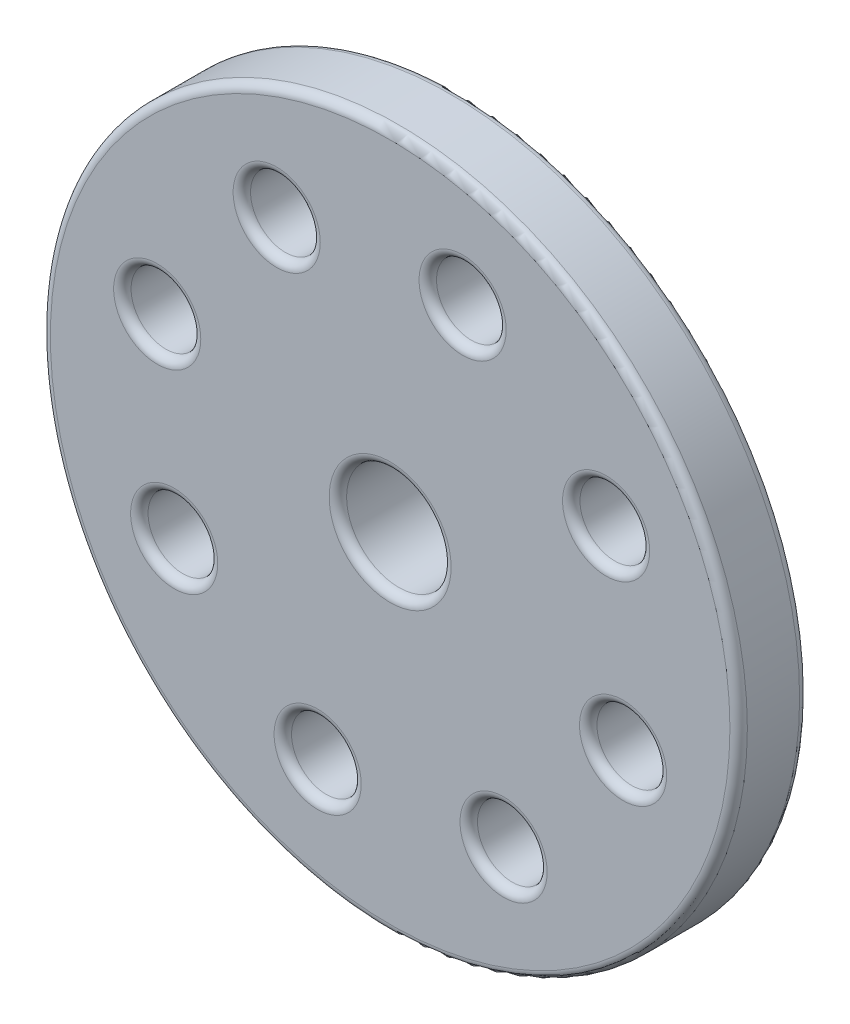
ISO-10303-21;
HEADER;
FILE_DESCRIPTION(('STEP AP214'),'2;1');
FILE_NAME('part.step','',(''),(''),'','','');
FILE_SCHEMA(('AUTOMOTIVE_DESIGN { 1 0 10303 214 1 1 1 1 }'));
ENDSEC;
DATA;
#1=APPLICATION_CONTEXT('core data for automotive mechanical design processes');
#2=APPLICATION_PROTOCOL_DEFINITION('international standard','automotive_design',2000,#1);
#3=PRODUCT_CONTEXT('',#1,'mechanical');
#4=PRODUCT('Part','Part','',(#3));
#5=PRODUCT_RELATED_PRODUCT_CATEGORY('part','',(#4));
#6=PRODUCT_DEFINITION_FORMATION('','',#4);
#7=PRODUCT_DEFINITION_CONTEXT('part definition',#1,'design');
#8=PRODUCT_DEFINITION('design','',#6,#7);
#9=PRODUCT_DEFINITION_SHAPE('','',#8);
#10=(LENGTH_UNIT() NAMED_UNIT(*) SI_UNIT(.MILLI.,.METRE.));
#11=(NAMED_UNIT(*) PLANE_ANGLE_UNIT() SI_UNIT($,.RADIAN.));
#12=(NAMED_UNIT(*) SI_UNIT($,.STERADIAN.) SOLID_ANGLE_UNIT());
#13=UNCERTAINTY_MEASURE_WITH_UNIT(LENGTH_MEASURE(1.E-05),#10,'distance_accuracy_value','');
#14=(GEOMETRIC_REPRESENTATION_CONTEXT(3) GLOBAL_UNCERTAINTY_ASSIGNED_CONTEXT((#13)) GLOBAL_UNIT_ASSIGNED_CONTEXT((#10,
#11,#12)) REPRESENTATION_CONTEXT('',''));
#15=CARTESIAN_POINT('',(0.,0.,0.));
#16=DIRECTION('',(0.,0.,1.));
#17=DIRECTION('',(1.,0.,0.));
#18=AXIS2_PLACEMENT_3D('',#15,#16,#17);
#19=CARTESIAN_POINT('',(-14.5012777172546,-1.85900163897672,0.));
#20=DIRECTION('',(0.,0.,1.));
#21=DIRECTION('',(1.,0.,0.));
#22=AXIS2_PLACEMENT_3D('',#19,#20,#21);
#23=PLANE('',#22);
#24=CARTESIAN_POINT('',(-7.81748126239068,-3.93911340278849,0.));
#25=DIRECTION('',(0.,0.,1.));
#26=DIRECTION('',(1.,0.,0.));
#27=AXIS2_PLACEMENT_3D('',#24,#25,#26);
#28=CIRCLE('',#27,1.25);
#29=CARTESIAN_POINT('',(-6.56748126239068,-3.93911340278849,0.));
#30=VERTEX_POINT('',#29);
#31=EDGE_CURVE('E88',#30,#30,#28,.T.);
#32=ORIENTED_EDGE('',*,*,#31,.T.);
#33=EDGE_LOOP('',(#32));
#34=FACE_BOUND('',#33,.T.);
#35=CARTESIAN_POINT('',(-11.2459810537669,-8.05602057009882,0.));
#36=DIRECTION('',(0.,0.,1.));
#37=DIRECTION('',(1.,0.,0.));
#38=AXIS2_PLACEMENT_3D('',#35,#36,#37);
#39=CIRCLE('',#38,1.25);
#40=CARTESIAN_POINT('',(-9.9959810537669,-8.05602057009882,0.));
#41=VERTEX_POINT('',#40);
#42=EDGE_CURVE('E91',#41,#41,#39,.T.);
#43=ORIENTED_EDGE('',*,*,#42,.T.);
#44=EDGE_LOOP('',(#43));
#45=FACE_BOUND('',#44,.T.);
#46=CARTESIAN_POINT('',(-16.5813894810664,-8.54279809384068,0.));
#47=DIRECTION('',(0.,0.,1.));
#48=DIRECTION('',(1.,0.,0.));
#49=AXIS2_PLACEMENT_3D('',#46,#47,#48);
#50=CIRCLE('',#49,1.25);
#51=CARTESIAN_POINT('',(-15.3313894810664,-8.54279809384068,0.));
#52=VERTEX_POINT('',#51);
#53=EDGE_CURVE('E94',#52,#52,#50,.T.);
#54=ORIENTED_EDGE('',*,*,#53,.T.);
#55=EDGE_LOOP('',(#54));
#56=FACE_BOUND('',#55,.T.);
#57=CARTESIAN_POINT('',(-20.6982966483767,-5.11429830246442,0.));
#58=DIRECTION('',(0.,0.,1.));
#59=DIRECTION('',(1.,0.,0.));
#60=AXIS2_PLACEMENT_3D('',#57,#58,#59);
#61=CIRCLE('',#60,1.25);
#62=CARTESIAN_POINT('',(-19.4482966483767,-5.11429830246442,0.));
#63=VERTEX_POINT('',#62);
#64=EDGE_CURVE('E97',#63,#63,#61,.T.);
#65=ORIENTED_EDGE('',*,*,#64,.T.);
#66=EDGE_LOOP('',(#65));
#67=FACE_BOUND('',#66,.T.);
#68=CARTESIAN_POINT('',(-21.1850741721186,0.22111012483505,0.));
#69=DIRECTION('',(0.,0.,1.));
#70=DIRECTION('',(1.,0.,0.));
#71=AXIS2_PLACEMENT_3D('',#68,#69,#70);
#72=CIRCLE('',#71,1.25);
#73=CARTESIAN_POINT('',(-19.9350741721186,0.22111012483505,0.));
#74=VERTEX_POINT('',#73);
#75=EDGE_CURVE('E100',#74,#74,#72,.T.);
#76=ORIENTED_EDGE('',*,*,#75,.T.);
#77=EDGE_LOOP('',(#76));
#78=FACE_BOUND('',#77,.T.);
#79=CARTESIAN_POINT('',(-17.7565743807423,4.3380172921454,0.));
#80=DIRECTION('',(0.,0.,1.));
#81=DIRECTION('',(1.,0.,0.));
#82=AXIS2_PLACEMENT_3D('',#79,#80,#81);
#83=CIRCLE('',#82,1.25);
#84=CARTESIAN_POINT('',(-16.5065743807423,4.3380172921454,0.));
#85=VERTEX_POINT('',#84);
#86=EDGE_CURVE('E103',#85,#85,#83,.T.);
#87=ORIENTED_EDGE('',*,*,#86,.T.);
#88=EDGE_LOOP('',(#87));
#89=FACE_BOUND('',#88,.T.);
#90=CARTESIAN_POINT('',(-12.4211659534428,4.82479481588722,0.));
#91=DIRECTION('',(0.,0.,1.));
#92=DIRECTION('',(1.,0.,0.));
#93=AXIS2_PLACEMENT_3D('',#90,#91,#92);
#94=CIRCLE('',#93,1.25);
#95=CARTESIAN_POINT('',(-11.1711659534428,4.82479481588722,0.));
#96=VERTEX_POINT('',#95);
#97=EDGE_CURVE('E106',#96,#96,#94,.T.);
#98=ORIENTED_EDGE('',*,*,#97,.T.);
#99=EDGE_LOOP('',(#98));
#100=FACE_BOUND('',#99,.T.);
#101=CARTESIAN_POINT('',(-8.30425878613253,1.39629502451098,0.));
#102=DIRECTION('',(0.,0.,1.));
#103=DIRECTION('',(1.,0.,0.));
#104=AXIS2_PLACEMENT_3D('',#101,#102,#103);
#105=CIRCLE('',#104,1.24999999999999);
#106=CARTESIAN_POINT('',(-7.05425878613253,1.39629502451098,0.));
#107=VERTEX_POINT('',#106);
#108=EDGE_CURVE('E109',#107,#107,#105,.T.);
#109=ORIENTED_EDGE('',*,*,#108,.T.);
#110=EDGE_LOOP('',(#109));
#111=FACE_BOUND('',#110,.T.);
#112=CARTESIAN_POINT('',(-14.5012777172546,-1.85900163897672,0.));
#113=DIRECTION('',(0.,0.,1.));
#114=DIRECTION('',(1.,0.,0.));
#115=AXIS2_PLACEMENT_3D('',#112,#113,#114);
#116=CIRCLE('',#115,9.75000000000001);
#117=CARTESIAN_POINT('',(-4.75127771725463,-1.85900163897672,0.));
#118=VERTEX_POINT('',#117);
#119=EDGE_CURVE('E154',#118,#118,#116,.F.);
#120=ORIENTED_EDGE('',*,*,#119,.T.);
#121=EDGE_LOOP('',(#120));
#122=FACE_BOUND('',#121,.T.);
#123=CARTESIAN_POINT('',(-14.5012777172546,-1.85900163897672,0.));
#124=DIRECTION('',(0.,0.,1.));
#125=DIRECTION('',(1.,0.,0.));
#126=AXIS2_PLACEMENT_3D('',#123,#124,#125);
#127=CIRCLE('',#126,5.);
#128=CARTESIAN_POINT('',(-9.50127771725463,-1.85900163897672,0.));
#129=VERTEX_POINT('',#128);
#130=EDGE_CURVE('E163',#129,#129,#127,.F.);
#131=ORIENTED_EDGE('',*,*,#130,.F.);
#132=EDGE_LOOP('',(#131));
#133=FACE_BOUND('',#132,.T.);
#134=ADVANCED_FACE('F32',(#34,#45,#56,#67,#78,#89,#100,#111,#122,#133),#23,.F.);
#135=CARTESIAN_POINT('',(-14.5012777172546,-1.85900163897672,2.));
#136=DIRECTION('',(0.,0.,1.));
#137=DIRECTION('',(1.,0.,0.));
#138=AXIS2_PLACEMENT_3D('',#135,#136,#137);
#139=PLANE('',#138);
#140=CARTESIAN_POINT('',(-14.5012777172546,-1.85900163897672,2.));
#141=DIRECTION('',(0.,0.,1.));
#142=DIRECTION('',(1.,0.,0.));
#143=AXIS2_PLACEMENT_3D('',#140,#141,#142);
#144=CIRCLE('',#143,1.75);
#145=CARTESIAN_POINT('',(-12.7512777172546,-1.85900163897672,2.));
#146=VERTEX_POINT('',#145);
#147=EDGE_CURVE('E112',#146,#146,#144,.F.);
#148=ORIENTED_EDGE('',*,*,#147,.T.);
#149=EDGE_LOOP('',(#148));
#150=FACE_BOUND('',#149,.T.);
#151=CARTESIAN_POINT('',(-7.81748126239068,-3.93911340278849,2.));
#152=DIRECTION('',(0.,0.,1.));
#153=DIRECTION('',(1.,0.,0.));
#154=AXIS2_PLACEMENT_3D('',#151,#152,#153);
#155=CIRCLE('',#154,1.25);
#156=CARTESIAN_POINT('',(-6.56748126239068,-3.93911340278849,2.));
#157=VERTEX_POINT('',#156);
#158=EDGE_CURVE('E115',#157,#157,#155,.F.);
#159=ORIENTED_EDGE('',*,*,#158,.T.);
#160=EDGE_LOOP('',(#159));
#161=FACE_BOUND('',#160,.T.);
#162=CARTESIAN_POINT('',(-11.2459810537669,-8.05602057009882,2.));
#163=DIRECTION('',(0.,0.,1.));
#164=DIRECTION('',(1.,0.,0.));
#165=AXIS2_PLACEMENT_3D('',#162,#163,#164);
#166=CIRCLE('',#165,1.25);
#167=CARTESIAN_POINT('',(-9.9959810537669,-8.05602057009882,2.));
#168=VERTEX_POINT('',#167);
#169=EDGE_CURVE('E118',#168,#168,#166,.F.);
#170=ORIENTED_EDGE('',*,*,#169,.T.);
#171=EDGE_LOOP('',(#170));
#172=FACE_BOUND('',#171,.T.);
#173=CARTESIAN_POINT('',(-16.5813894810664,-8.54279809384068,2.));
#174=DIRECTION('',(0.,0.,1.));
#175=DIRECTION('',(1.,0.,0.));
#176=AXIS2_PLACEMENT_3D('',#173,#174,#175);
#177=CIRCLE('',#176,1.25);
#178=CARTESIAN_POINT('',(-15.3313894810664,-8.54279809384068,2.));
#179=VERTEX_POINT('',#178);
#180=EDGE_CURVE('E121',#179,#179,#177,.F.);
#181=ORIENTED_EDGE('',*,*,#180,.T.);
#182=EDGE_LOOP('',(#181));
#183=FACE_BOUND('',#182,.T.);
#184=CARTESIAN_POINT('',(-20.6982966483767,-5.11429830246442,2.));
#185=DIRECTION('',(0.,0.,1.));
#186=DIRECTION('',(1.,0.,0.));
#187=AXIS2_PLACEMENT_3D('',#184,#185,#186);
#188=CIRCLE('',#187,1.25);
#189=CARTESIAN_POINT('',(-19.4482966483767,-5.11429830246442,2.));
#190=VERTEX_POINT('',#189);
#191=EDGE_CURVE('E124',#190,#190,#188,.F.);
#192=ORIENTED_EDGE('',*,*,#191,.T.);
#193=EDGE_LOOP('',(#192));
#194=FACE_BOUND('',#193,.T.);
#195=CARTESIAN_POINT('',(-21.1850741721186,0.22111012483505,2.));
#196=DIRECTION('',(0.,0.,1.));
#197=DIRECTION('',(1.,0.,0.));
#198=AXIS2_PLACEMENT_3D('',#195,#196,#197);
#199=CIRCLE('',#198,1.25);
#200=CARTESIAN_POINT('',(-19.9350741721186,0.22111012483505,2.));
#201=VERTEX_POINT('',#200);
#202=EDGE_CURVE('E127',#201,#201,#199,.F.);
#203=ORIENTED_EDGE('',*,*,#202,.T.);
#204=EDGE_LOOP('',(#203));
#205=FACE_BOUND('',#204,.T.);
#206=CARTESIAN_POINT('',(-17.7565743807423,4.3380172921454,2.));
#207=DIRECTION('',(0.,0.,1.));
#208=DIRECTION('',(1.,0.,0.));
#209=AXIS2_PLACEMENT_3D('',#206,#207,#208);
#210=CIRCLE('',#209,1.25);
#211=CARTESIAN_POINT('',(-16.5065743807423,4.3380172921454,2.));
#212=VERTEX_POINT('',#211);
#213=EDGE_CURVE('E130',#212,#212,#210,.F.);
#214=ORIENTED_EDGE('',*,*,#213,.T.);
#215=EDGE_LOOP('',(#214));
#216=FACE_BOUND('',#215,.T.);
#217=CARTESIAN_POINT('',(-12.4211659534428,4.82479481588722,2.));
#218=DIRECTION('',(0.,0.,1.));
#219=DIRECTION('',(1.,0.,0.));
#220=AXIS2_PLACEMENT_3D('',#217,#218,#219);
#221=CIRCLE('',#220,1.25);
#222=CARTESIAN_POINT('',(-11.1711659534428,4.82479481588722,2.));
#223=VERTEX_POINT('',#222);
#224=EDGE_CURVE('E133',#223,#223,#221,.F.);
#225=ORIENTED_EDGE('',*,*,#224,.T.);
#226=EDGE_LOOP('',(#225));
#227=FACE_BOUND('',#226,.T.);
#228=CARTESIAN_POINT('',(-8.30425878613253,1.39629502451098,2.));
#229=DIRECTION('',(0.,0.,1.));
#230=DIRECTION('',(1.,0.,0.));
#231=AXIS2_PLACEMENT_3D('',#228,#229,#230);
#232=CIRCLE('',#231,1.24999999999999);
#233=CARTESIAN_POINT('',(-7.05425878613253,1.39629502451098,2.));
#234=VERTEX_POINT('',#233);
#235=EDGE_CURVE('E136',#234,#234,#232,.F.);
#236=ORIENTED_EDGE('',*,*,#235,.T.);
#237=EDGE_LOOP('',(#236));
#238=FACE_BOUND('',#237,.T.);
#239=CARTESIAN_POINT('',(-14.5012777172546,-1.85900163897672,2.));
#240=DIRECTION('',(0.,0.,1.));
#241=DIRECTION('',(1.,0.,0.));
#242=AXIS2_PLACEMENT_3D('',#239,#240,#241);
#243=CIRCLE('',#242,9.75000000000001);
#244=CARTESIAN_POINT('',(-4.75127771725463,-1.85900163897672,2.));
#245=VERTEX_POINT('',#244);
#246=EDGE_CURVE('E151',#245,#245,#243,.T.);
#247=ORIENTED_EDGE('',*,*,#246,.T.);
#248=EDGE_LOOP('',(#247));
#249=FACE_BOUND('',#248,.T.);
#250=ADVANCED_FACE('F171',(#150,#161,#172,#183,#194,#205,#216,#227,#238,#249),#139,.T.);
#251=CARTESIAN_POINT('',(-14.5012777172546,-1.85900163897672,2.));
#252=DIRECTION('',(0.,0.,-1.));
#253=DIRECTION('',(-1.,0.,0.));
#254=AXIS2_PLACEMENT_3D('',#251,#252,#253);
#255=CYLINDRICAL_SURFACE('',#254,10.);
#256=CARTESIAN_POINT('',(-14.5012777172546,-1.85900163897672,1.75));
#257=DIRECTION('',(0.,0.,1.));
#258=DIRECTION('',(1.,0.,0.));
#259=AXIS2_PLACEMENT_3D('',#256,#257,#258);
#260=CIRCLE('',#259,10.);
#261=CARTESIAN_POINT('',(-4.50127771725463,-1.85900163897672,1.75));
#262=VERTEX_POINT('',#261);
#263=EDGE_CURVE('E148',#262,#262,#260,.F.);
#264=ORIENTED_EDGE('',*,*,#263,.T.);
#265=EDGE_LOOP('',(#264));
#266=FACE_BOUND('',#265,.T.);
#267=CARTESIAN_POINT('',(-14.5012777172546,-1.85900163897672,0.25));
#268=DIRECTION('',(0.,0.,1.));
#269=DIRECTION('',(1.,0.,0.));
#270=AXIS2_PLACEMENT_3D('',#267,#268,#269);
#271=CIRCLE('',#270,10.);
#272=CARTESIAN_POINT('',(-4.50127771725463,-1.85900163897672,0.25));
#273=VERTEX_POINT('',#272);
#274=EDGE_CURVE('E157',#273,#273,#271,.T.);
#275=ORIENTED_EDGE('',*,*,#274,.T.);
#276=EDGE_LOOP('',(#275));
#277=FACE_BOUND('',#276,.T.);
#278=ADVANCED_FACE('F177',(#266,#277),#255,.T.);
#279=CARTESIAN_POINT('',(-20.6982966483767,-5.11429830246442,2.));
#280=DIRECTION('',(0.,0.,-1.));
#281=DIRECTION('',(-1.,0.,0.));
#282=AXIS2_PLACEMENT_3D('',#279,#280,#281);
#283=CYLINDRICAL_SURFACE('',#282,1.);
#284=CARTESIAN_POINT('',(-20.6982966483767,-5.11429830246442,0.25));
#285=DIRECTION('',(0.,0.,1.));
#286=DIRECTION('',(1.,0.,0.));
#287=AXIS2_PLACEMENT_3D('',#284,#285,#286);
#288=CIRCLE('',#287,1.);
#289=CARTESIAN_POINT('',(-19.6982966483767,-5.11429830246442,0.25));
#290=VERTEX_POINT('',#289);
#291=EDGE_CURVE('E64',#290,#290,#288,.F.);
#292=ORIENTED_EDGE('',*,*,#291,.T.);
#293=EDGE_LOOP('',(#292));
#294=FACE_BOUND('',#293,.T.);
#295=CARTESIAN_POINT('',(-20.6982966483767,-5.11429830246442,1.75));
#296=DIRECTION('',(0.,0.,1.));
#297=DIRECTION('',(1.,0.,0.));
#298=AXIS2_PLACEMENT_3D('',#295,#296,#297);
#299=CIRCLE('',#298,1.);
#300=CARTESIAN_POINT('',(-19.6982966483767,-5.11429830246442,1.75));
#301=VERTEX_POINT('',#300);
#302=EDGE_CURVE('E67',#301,#301,#299,.T.);
#303=ORIENTED_EDGE('',*,*,#302,.T.);
#304=EDGE_LOOP('',(#303));
#305=FACE_BOUND('',#304,.T.);
#306=ADVANCED_FACE('F185',(#294,#305),#283,.F.);
#307=CARTESIAN_POINT('',(-14.5012777172546,-1.85900163897672,2.));
#308=DIRECTION('',(0.,0.,-1.));
#309=DIRECTION('',(-1.,0.,0.));
#310=AXIS2_PLACEMENT_3D('',#307,#308,#309);
#311=CYLINDRICAL_SURFACE('',#310,1.5);
#312=CARTESIAN_POINT('',(-14.5012777172546,-1.85900163897672,-0.75));
#313=DIRECTION('',(0.,0.,-1.));
#314=DIRECTION('',(-1.,0.,0.));
#315=AXIS2_PLACEMENT_3D('',#312,#313,#314);
#316=CIRCLE('',#315,1.5);
#317=CARTESIAN_POINT('',(-16.0012777172546,-1.85900163897672,-0.75));
#318=VERTEX_POINT('',#317);
#319=EDGE_CURVE('E142',#318,#318,#316,.T.);
#320=ORIENTED_EDGE('',*,*,#319,.T.);
#321=EDGE_LOOP('',(#320));
#322=FACE_BOUND('',#321,.T.);
#323=CARTESIAN_POINT('',(-14.5012777172546,-1.85900163897672,1.75));
#324=DIRECTION('',(0.,0.,1.));
#325=DIRECTION('',(1.,0.,0.));
#326=AXIS2_PLACEMENT_3D('',#323,#324,#325);
#327=CIRCLE('',#326,1.5);
#328=CARTESIAN_POINT('',(-13.0012777172546,-1.85900163897672,1.75));
#329=VERTEX_POINT('',#328);
#330=EDGE_CURVE('E145',#329,#329,#327,.T.);
#331=ORIENTED_EDGE('',*,*,#330,.T.);
#332=EDGE_LOOP('',(#331));
#333=FACE_BOUND('',#332,.T.);
#334=ADVANCED_FACE('F466',(#322,#333),#311,.F.);
#335=CARTESIAN_POINT('',(-16.5813894810664,-8.54279809384068,2.));
#336=DIRECTION('',(0.,0.,-1.));
#337=DIRECTION('',(-1.,0.,0.));
#338=AXIS2_PLACEMENT_3D('',#335,#336,#337);
#339=CYLINDRICAL_SURFACE('',#338,1.);
#340=CARTESIAN_POINT('',(-16.5813894810664,-8.54279809384068,0.25));
#341=DIRECTION('',(0.,0.,1.));
#342=DIRECTION('',(1.,0.,0.));
#343=AXIS2_PLACEMENT_3D('',#340,#341,#342);
#344=CIRCLE('',#343,1.);
#345=CARTESIAN_POINT('',(-15.5813894810664,-8.54279809384068,0.25));
#346=VERTEX_POINT('',#345);
#347=EDGE_CURVE('E70',#346,#346,#344,.F.);
#348=ORIENTED_EDGE('',*,*,#347,.T.);
#349=EDGE_LOOP('',(#348));
#350=FACE_BOUND('',#349,.T.);
#351=CARTESIAN_POINT('',(-16.5813894810664,-8.54279809384068,1.75));
#352=DIRECTION('',(0.,0.,1.));
#353=DIRECTION('',(1.,0.,0.));
#354=AXIS2_PLACEMENT_3D('',#351,#352,#353);
#355=CIRCLE('',#354,1.);
#356=CARTESIAN_POINT('',(-15.5813894810664,-8.54279809384068,1.75));
#357=VERTEX_POINT('',#356);
#358=EDGE_CURVE('E73',#357,#357,#355,.T.);
#359=ORIENTED_EDGE('',*,*,#358,.T.);
#360=EDGE_LOOP('',(#359));
#361=FACE_BOUND('',#360,.T.);
#362=ADVANCED_FACE('F456',(#350,#361),#339,.F.);
#363=CARTESIAN_POINT('',(-21.1850741721186,0.22111012483505,2.));
#364=DIRECTION('',(0.,0.,-1.));
#365=DIRECTION('',(-1.,0.,0.));
#366=AXIS2_PLACEMENT_3D('',#363,#364,#365);
#367=CYLINDRICAL_SURFACE('',#366,1.);
#368=CARTESIAN_POINT('',(-21.1850741721186,0.22111012483505,0.25));
#369=DIRECTION('',(0.,0.,1.));
#370=DIRECTION('',(1.,0.,0.));
#371=AXIS2_PLACEMENT_3D('',#368,#369,#370);
#372=CIRCLE('',#371,1.);
#373=CARTESIAN_POINT('',(-20.1850741721186,0.22111012483505,0.25));
#374=VERTEX_POINT('',#373);
#375=EDGE_CURVE('E58',#374,#374,#372,.F.);
#376=ORIENTED_EDGE('',*,*,#375,.T.);
#377=EDGE_LOOP('',(#376));
#378=FACE_BOUND('',#377,.T.);
#379=CARTESIAN_POINT('',(-21.1850741721186,0.22111012483505,1.75));
#380=DIRECTION('',(0.,0.,1.));
#381=DIRECTION('',(1.,0.,0.));
#382=AXIS2_PLACEMENT_3D('',#379,#380,#381);
#383=CIRCLE('',#382,1.);
#384=CARTESIAN_POINT('',(-20.1850741721186,0.22111012483505,1.75));
#385=VERTEX_POINT('',#384);
#386=EDGE_CURVE('E61',#385,#385,#383,.T.);
#387=ORIENTED_EDGE('',*,*,#386,.T.);
#388=EDGE_LOOP('',(#387));
#389=FACE_BOUND('',#388,.T.);
#390=ADVANCED_FACE('F446',(#378,#389),#367,.F.);
#391=CARTESIAN_POINT('',(-12.4211659534428,4.82479481588722,2.));
#392=DIRECTION('',(0.,0.,-1.));
#393=DIRECTION('',(-1.,0.,0.));
#394=AXIS2_PLACEMENT_3D('',#391,#392,#393);
#395=CYLINDRICAL_SURFACE('',#394,1.);
#396=CARTESIAN_POINT('',(-12.4211659534428,4.82479481588722,0.25));
#397=DIRECTION('',(0.,0.,1.));
#398=DIRECTION('',(1.,0.,0.));
#399=AXIS2_PLACEMENT_3D('',#396,#397,#398);
#400=CIRCLE('',#399,1.);
#401=CARTESIAN_POINT('',(-11.4211659534428,4.82479481588722,0.25));
#402=VERTEX_POINT('',#401);
#403=EDGE_CURVE('E43',#402,#402,#400,.F.);
#404=ORIENTED_EDGE('',*,*,#403,.T.);
#405=EDGE_LOOP('',(#404));
#406=FACE_BOUND('',#405,.T.);
#407=CARTESIAN_POINT('',(-12.4211659534428,4.82479481588722,1.75));
#408=DIRECTION('',(0.,0.,1.));
#409=DIRECTION('',(1.,0.,0.));
#410=AXIS2_PLACEMENT_3D('',#407,#408,#409);
#411=CIRCLE('',#410,1.);
#412=CARTESIAN_POINT('',(-11.4211659534428,4.82479481588722,1.75));
#413=VERTEX_POINT('',#412);
#414=EDGE_CURVE('E47',#413,#413,#411,.T.);
#415=ORIENTED_EDGE('',*,*,#414,.T.);
#416=EDGE_LOOP('',(#415));
#417=FACE_BOUND('',#416,.T.);
#418=ADVANCED_FACE('F436',(#406,#417),#395,.F.);
#419=CARTESIAN_POINT('',(-7.81748126239068,-3.93911340278849,2.));
#420=DIRECTION('',(0.,0.,-1.));
#421=DIRECTION('',(-1.,0.,0.));
#422=AXIS2_PLACEMENT_3D('',#419,#420,#421);
#423=CYLINDRICAL_SURFACE('',#422,1.);
#424=CARTESIAN_POINT('',(-7.81748126239068,-3.93911340278849,0.25));
#425=DIRECTION('',(0.,0.,1.));
#426=DIRECTION('',(1.,0.,0.));
#427=AXIS2_PLACEMENT_3D('',#424,#425,#426);
#428=CIRCLE('',#427,1.);
#429=CARTESIAN_POINT('',(-6.81748126239068,-3.93911340278849,0.25));
#430=VERTEX_POINT('',#429);
#431=EDGE_CURVE('E82',#430,#430,#428,.F.);
#432=ORIENTED_EDGE('',*,*,#431,.T.);
#433=EDGE_LOOP('',(#432));
#434=FACE_BOUND('',#433,.T.);
#435=CARTESIAN_POINT('',(-7.81748126239068,-3.93911340278849,1.75));
#436=DIRECTION('',(0.,0.,1.));
#437=DIRECTION('',(1.,0.,0.));
#438=AXIS2_PLACEMENT_3D('',#435,#436,#437);
#439=CIRCLE('',#438,1.);
#440=CARTESIAN_POINT('',(-6.81748126239068,-3.93911340278849,1.75));
#441=VERTEX_POINT('',#440);
#442=EDGE_CURVE('E85',#441,#441,#439,.T.);
#443=ORIENTED_EDGE('',*,*,#442,.T.);
#444=EDGE_LOOP('',(#443));
#445=FACE_BOUND('',#444,.T.);
#446=ADVANCED_FACE('F426',(#434,#445),#423,.F.);
#447=CARTESIAN_POINT('',(-11.2459810537669,-8.05602057009882,2.));
#448=DIRECTION('',(0.,0.,-1.));
#449=DIRECTION('',(-1.,0.,0.));
#450=AXIS2_PLACEMENT_3D('',#447,#448,#449);
#451=CYLINDRICAL_SURFACE('',#450,1.);
#452=CARTESIAN_POINT('',(-11.2459810537669,-8.05602057009882,0.25));
#453=DIRECTION('',(0.,0.,1.));
#454=DIRECTION('',(1.,0.,0.));
#455=AXIS2_PLACEMENT_3D('',#452,#453,#454);
#456=CIRCLE('',#455,1.);
#457=CARTESIAN_POINT('',(-10.2459810537669,-8.05602057009882,0.25));
#458=VERTEX_POINT('',#457);
#459=EDGE_CURVE('E76',#458,#458,#456,.F.);
#460=ORIENTED_EDGE('',*,*,#459,.T.);
#461=EDGE_LOOP('',(#460));
#462=FACE_BOUND('',#461,.T.);
#463=CARTESIAN_POINT('',(-11.2459810537669,-8.05602057009882,1.75));
#464=DIRECTION('',(0.,0.,1.));
#465=DIRECTION('',(1.,0.,0.));
#466=AXIS2_PLACEMENT_3D('',#463,#464,#465);
#467=CIRCLE('',#466,1.);
#468=CARTESIAN_POINT('',(-10.2459810537669,-8.05602057009882,1.75));
#469=VERTEX_POINT('',#468);
#470=EDGE_CURVE('E79',#469,#469,#467,.T.);
#471=ORIENTED_EDGE('',*,*,#470,.T.);
#472=EDGE_LOOP('',(#471));
#473=FACE_BOUND('',#472,.T.);
#474=ADVANCED_FACE('F416',(#462,#473),#451,.F.);
#475=CARTESIAN_POINT('',(-17.7565743807423,4.3380172921454,2.));
#476=DIRECTION('',(0.,0.,-1.));
#477=DIRECTION('',(-1.,0.,0.));
#478=AXIS2_PLACEMENT_3D('',#475,#476,#477);
#479=CYLINDRICAL_SURFACE('',#478,1.);
#480=CARTESIAN_POINT('',(-17.7565743807423,4.3380172921454,0.25));
#481=DIRECTION('',(0.,0.,1.));
#482=DIRECTION('',(1.,0.,0.));
#483=AXIS2_PLACEMENT_3D('',#480,#481,#482);
#484=CIRCLE('',#483,1.);
#485=CARTESIAN_POINT('',(-16.7565743807423,4.3380172921454,0.25));
#486=VERTEX_POINT('',#485);
#487=EDGE_CURVE('E52',#486,#486,#484,.F.);
#488=ORIENTED_EDGE('',*,*,#487,.T.);
#489=EDGE_LOOP('',(#488));
#490=FACE_BOUND('',#489,.T.);
#491=CARTESIAN_POINT('',(-17.7565743807423,4.3380172921454,1.75));
#492=DIRECTION('',(0.,0.,1.));
#493=DIRECTION('',(1.,0.,0.));
#494=AXIS2_PLACEMENT_3D('',#491,#492,#493);
#495=CIRCLE('',#494,1.);
#496=CARTESIAN_POINT('',(-16.7565743807423,4.3380172921454,1.75));
#497=VERTEX_POINT('',#496);
#498=EDGE_CURVE('E55',#497,#497,#495,.T.);
#499=ORIENTED_EDGE('',*,*,#498,.T.);
#500=EDGE_LOOP('',(#499));
#501=FACE_BOUND('',#500,.T.);
#502=ADVANCED_FACE('F406',(#490,#501),#479,.F.);
#503=CARTESIAN_POINT('',(-8.30425878613253,1.39629502451098,2.));
#504=DIRECTION('',(0.,0.,-1.));
#505=DIRECTION('',(-1.,0.,0.));
#506=AXIS2_PLACEMENT_3D('',#503,#504,#505);
#507=CYLINDRICAL_SURFACE('',#506,0.999999999999992);
#508=CARTESIAN_POINT('',(-8.30425878613253,1.39629502451098,0.25));
#509=DIRECTION('',(0.,0.,1.));
#510=DIRECTION('',(1.,0.,0.));
#511=AXIS2_PLACEMENT_3D('',#508,#509,#510);
#512=CIRCLE('',#511,0.999999999999992);
#513=CARTESIAN_POINT('',(-7.30425878613253,1.39629502451098,0.25));
#514=VERTEX_POINT('',#513);
#515=EDGE_CURVE('E10',#514,#514,#512,.F.);
#516=ORIENTED_EDGE('',*,*,#515,.T.);
#517=EDGE_LOOP('',(#516));
#518=FACE_BOUND('',#517,.T.);
#519=CARTESIAN_POINT('',(-8.30425878613253,1.39629502451098,1.75));
#520=DIRECTION('',(0.,0.,1.));
#521=DIRECTION('',(1.,0.,0.));
#522=AXIS2_PLACEMENT_3D('',#519,#520,#521);
#523=CIRCLE('',#522,0.999999999999992);
#524=CARTESIAN_POINT('',(-7.30425878613253,1.39629502451098,1.75));
#525=VERTEX_POINT('',#524);
#526=EDGE_CURVE('E39',#525,#525,#523,.T.);
#527=ORIENTED_EDGE('',*,*,#526,.T.);
#528=EDGE_LOOP('',(#527));
#529=FACE_BOUND('',#528,.T.);
#530=ADVANCED_FACE('F394',(#518,#529),#507,.F.);
#531=CARTESIAN_POINT('',(-14.5012777172546,-1.85900163897672,-1.));
#532=DIRECTION('',(0.,0.,-1.));
#533=DIRECTION('',(-1.,0.,0.));
#534=AXIS2_PLACEMENT_3D('',#531,#532,#533);
#535=PLANE('',#534);
#536=CARTESIAN_POINT('',(-14.5012777172546,-1.85900163897672,-1.));
#537=DIRECTION('',(0.,0.,-1.));
#538=DIRECTION('',(-1.,0.,0.));
#539=AXIS2_PLACEMENT_3D('',#536,#537,#538);
#540=CIRCLE('',#539,1.75);
#541=CARTESIAN_POINT('',(-16.2512777172546,-1.85900163897672,-1.));
#542=VERTEX_POINT('',#541);
#543=EDGE_CURVE('E139',#542,#542,#540,.F.);
#544=ORIENTED_EDGE('',*,*,#543,.T.);
#545=EDGE_LOOP('',(#544));
#546=FACE_BOUND('',#545,.T.);
#547=CARTESIAN_POINT('',(-14.5012777172546,-1.85900163897672,-1.));
#548=DIRECTION('',(0.,0.,-1.));
#549=DIRECTION('',(-1.,0.,0.));
#550=AXIS2_PLACEMENT_3D('',#547,#548,#549);
#551=CIRCLE('',#550,4.);
#552=CARTESIAN_POINT('',(-18.5012777172546,-1.85900163897672,-1.));
#553=VERTEX_POINT('',#552);
#554=EDGE_CURVE('E160',#553,#553,#551,.T.);
#555=ORIENTED_EDGE('',*,*,#554,.T.);
#556=EDGE_LOOP('',(#555));
#557=FACE_BOUND('',#556,.T.);
#558=ADVANCED_FACE('F190',(#546,#557),#535,.T.);
#559=CARTESIAN_POINT('',(-14.5012777172546,-1.85900163897672,0.));
#560=DIRECTION('',(0.,0.,-1.));
#561=DIRECTION('',(-1.,0.,0.));
#562=AXIS2_PLACEMENT_3D('',#559,#560,#561);
#563=TOROIDAL_SURFACE('',#562,4.,1.);
#564=ORIENTED_EDGE('',*,*,#130,.T.);
#565=EDGE_LOOP('',(#564));
#566=FACE_BOUND('',#565,.T.);
#567=ORIENTED_EDGE('',*,*,#554,.F.);
#568=EDGE_LOOP('',(#567));
#569=FACE_BOUND('',#568,.T.);
#570=ADVANCED_FACE('F167',(#566,#569),#563,.T.);
#571=CARTESIAN_POINT('',(-14.5012777172546,-1.85900163897672,0.25));
#572=DIRECTION('',(0.,0.,1.));
#573=DIRECTION('',(1.,0.,0.));
#574=AXIS2_PLACEMENT_3D('',#571,#572,#573);
#575=TOROIDAL_SURFACE('',#574,9.75000000000001,0.25);
#576=ORIENTED_EDGE('',*,*,#119,.F.);
#577=EDGE_LOOP('',(#576));
#578=FACE_BOUND('',#577,.T.);
#579=ORIENTED_EDGE('',*,*,#274,.F.);
#580=EDGE_LOOP('',(#579));
#581=FACE_BOUND('',#580,.T.);
#582=ADVANCED_FACE('F189',(#578,#581),#575,.T.);
#583=CARTESIAN_POINT('',(-14.5012777172546,-1.85900163897672,1.75));
#584=DIRECTION('',(0.,0.,1.));
#585=DIRECTION('',(1.,0.,0.));
#586=AXIS2_PLACEMENT_3D('',#583,#584,#585);
#587=TOROIDAL_SURFACE('',#586,9.75000000000001,0.25);
#588=ORIENTED_EDGE('',*,*,#263,.F.);
#589=EDGE_LOOP('',(#588));
#590=FACE_BOUND('',#589,.T.);
#591=ORIENTED_EDGE('',*,*,#246,.F.);
#592=EDGE_LOOP('',(#591));
#593=FACE_BOUND('',#592,.T.);
#594=ADVANCED_FACE('F193',(#590,#593),#587,.T.);
#595=CARTESIAN_POINT('',(-14.5012777172546,-1.85900163897672,-0.75));
#596=DIRECTION('',(0.,0.,-1.));
#597=DIRECTION('',(-1.,0.,0.));
#598=AXIS2_PLACEMENT_3D('',#595,#596,#597);
#599=TOROIDAL_SURFACE('',#598,1.75,0.25);
#600=ORIENTED_EDGE('',*,*,#543,.F.);
#601=EDGE_LOOP('',(#600));
#602=FACE_BOUND('',#601,.T.);
#603=ORIENTED_EDGE('',*,*,#319,.F.);
#604=EDGE_LOOP('',(#603));
#605=FACE_BOUND('',#604,.T.);
#606=ADVANCED_FACE('F197',(#602,#605),#599,.T.);
#607=CARTESIAN_POINT('',(-14.5012777172546,-1.85900163897672,1.75));
#608=DIRECTION('',(0.,0.,1.));
#609=DIRECTION('',(1.,0.,0.));
#610=AXIS2_PLACEMENT_3D('',#607,#608,#609);
#611=TOROIDAL_SURFACE('',#610,1.75,0.25);
#612=ORIENTED_EDGE('',*,*,#147,.F.);
#613=EDGE_LOOP('',(#612));
#614=FACE_BOUND('',#613,.T.);
#615=ORIENTED_EDGE('',*,*,#330,.F.);
#616=EDGE_LOOP('',(#615));
#617=FACE_BOUND('',#616,.T.);
#618=ADVANCED_FACE('F201',(#614,#617),#611,.T.);
#619=CARTESIAN_POINT('',(-7.81748126239068,-3.93911340278849,0.25));
#620=DIRECTION('',(0.,0.,1.));
#621=DIRECTION('',(1.,0.,0.));
#622=AXIS2_PLACEMENT_3D('',#619,#620,#621);
#623=TOROIDAL_SURFACE('',#622,1.25,0.25);
#624=ORIENTED_EDGE('',*,*,#431,.F.);
#625=EDGE_LOOP('',(#624));
#626=FACE_BOUND('',#625,.T.);
#627=ORIENTED_EDGE('',*,*,#31,.F.);
#628=EDGE_LOOP('',(#627));
#629=FACE_BOUND('',#628,.T.);
#630=ADVANCED_FACE('F205',(#626,#629),#623,.T.);
#631=CARTESIAN_POINT('',(-7.81748126239068,-3.93911340278849,1.75));
#632=DIRECTION('',(0.,0.,1.));
#633=DIRECTION('',(1.,0.,0.));
#634=AXIS2_PLACEMENT_3D('',#631,#632,#633);
#635=TOROIDAL_SURFACE('',#634,1.25,0.25);
#636=ORIENTED_EDGE('',*,*,#158,.F.);
#637=EDGE_LOOP('',(#636));
#638=FACE_BOUND('',#637,.T.);
#639=ORIENTED_EDGE('',*,*,#442,.F.);
#640=EDGE_LOOP('',(#639));
#641=FACE_BOUND('',#640,.T.);
#642=ADVANCED_FACE('F209',(#638,#641),#635,.T.);
#643=CARTESIAN_POINT('',(-11.2459810537669,-8.05602057009882,0.25));
#644=DIRECTION('',(0.,0.,1.));
#645=DIRECTION('',(1.,0.,0.));
#646=AXIS2_PLACEMENT_3D('',#643,#644,#645);
#647=TOROIDAL_SURFACE('',#646,1.25,0.25);
#648=ORIENTED_EDGE('',*,*,#459,.F.);
#649=EDGE_LOOP('',(#648));
#650=FACE_BOUND('',#649,.T.);
#651=ORIENTED_EDGE('',*,*,#42,.F.);
#652=EDGE_LOOP('',(#651));
#653=FACE_BOUND('',#652,.T.);
#654=ADVANCED_FACE('F213',(#650,#653),#647,.T.);
#655=CARTESIAN_POINT('',(-11.2459810537669,-8.05602057009882,1.75));
#656=DIRECTION('',(0.,0.,1.));
#657=DIRECTION('',(1.,0.,0.));
#658=AXIS2_PLACEMENT_3D('',#655,#656,#657);
#659=TOROIDAL_SURFACE('',#658,1.25,0.25);
#660=ORIENTED_EDGE('',*,*,#169,.F.);
#661=EDGE_LOOP('',(#660));
#662=FACE_BOUND('',#661,.T.);
#663=ORIENTED_EDGE('',*,*,#470,.F.);
#664=EDGE_LOOP('',(#663));
#665=FACE_BOUND('',#664,.T.);
#666=ADVANCED_FACE('F217',(#662,#665),#659,.T.);
#667=CARTESIAN_POINT('',(-16.5813894810664,-8.54279809384068,0.25));
#668=DIRECTION('',(0.,0.,1.));
#669=DIRECTION('',(1.,0.,0.));
#670=AXIS2_PLACEMENT_3D('',#667,#668,#669);
#671=TOROIDAL_SURFACE('',#670,1.25,0.25);
#672=ORIENTED_EDGE('',*,*,#347,.F.);
#673=EDGE_LOOP('',(#672));
#674=FACE_BOUND('',#673,.T.);
#675=ORIENTED_EDGE('',*,*,#53,.F.);
#676=EDGE_LOOP('',(#675));
#677=FACE_BOUND('',#676,.T.);
#678=ADVANCED_FACE('F221',(#674,#677),#671,.T.);
#679=CARTESIAN_POINT('',(-16.5813894810664,-8.54279809384068,1.75));
#680=DIRECTION('',(0.,0.,1.));
#681=DIRECTION('',(1.,0.,0.));
#682=AXIS2_PLACEMENT_3D('',#679,#680,#681);
#683=TOROIDAL_SURFACE('',#682,1.25,0.25);
#684=ORIENTED_EDGE('',*,*,#180,.F.);
#685=EDGE_LOOP('',(#684));
#686=FACE_BOUND('',#685,.T.);
#687=ORIENTED_EDGE('',*,*,#358,.F.);
#688=EDGE_LOOP('',(#687));
#689=FACE_BOUND('',#688,.T.);
#690=ADVANCED_FACE('F225',(#686,#689),#683,.T.);
#691=CARTESIAN_POINT('',(-20.6982966483767,-5.11429830246442,0.25));
#692=DIRECTION('',(0.,0.,1.));
#693=DIRECTION('',(1.,0.,0.));
#694=AXIS2_PLACEMENT_3D('',#691,#692,#693);
#695=TOROIDAL_SURFACE('',#694,1.25,0.25);
#696=ORIENTED_EDGE('',*,*,#291,.F.);
#697=EDGE_LOOP('',(#696));
#698=FACE_BOUND('',#697,.T.);
#699=ORIENTED_EDGE('',*,*,#64,.F.);
#700=EDGE_LOOP('',(#699));
#701=FACE_BOUND('',#700,.T.);
#702=ADVANCED_FACE('F229',(#698,#701),#695,.T.);
#703=CARTESIAN_POINT('',(-20.6982966483767,-5.11429830246442,1.75));
#704=DIRECTION('',(0.,0.,1.));
#705=DIRECTION('',(1.,0.,0.));
#706=AXIS2_PLACEMENT_3D('',#703,#704,#705);
#707=TOROIDAL_SURFACE('',#706,1.25,0.25);
#708=ORIENTED_EDGE('',*,*,#191,.F.);
#709=EDGE_LOOP('',(#708));
#710=FACE_BOUND('',#709,.T.);
#711=ORIENTED_EDGE('',*,*,#302,.F.);
#712=EDGE_LOOP('',(#711));
#713=FACE_BOUND('',#712,.T.);
#714=ADVANCED_FACE('F233',(#710,#713),#707,.T.);
#715=CARTESIAN_POINT('',(-21.1850741721186,0.22111012483505,0.25));
#716=DIRECTION('',(0.,0.,1.));
#717=DIRECTION('',(1.,0.,0.));
#718=AXIS2_PLACEMENT_3D('',#715,#716,#717);
#719=TOROIDAL_SURFACE('',#718,1.25,0.25);
#720=ORIENTED_EDGE('',*,*,#375,.F.);
#721=EDGE_LOOP('',(#720));
#722=FACE_BOUND('',#721,.T.);
#723=ORIENTED_EDGE('',*,*,#75,.F.);
#724=EDGE_LOOP('',(#723));
#725=FACE_BOUND('',#724,.T.);
#726=ADVANCED_FACE('F237',(#722,#725),#719,.T.);
#727=CARTESIAN_POINT('',(-21.1850741721186,0.22111012483505,1.75));
#728=DIRECTION('',(0.,0.,1.));
#729=DIRECTION('',(1.,0.,0.));
#730=AXIS2_PLACEMENT_3D('',#727,#728,#729);
#731=TOROIDAL_SURFACE('',#730,1.25,0.25);
#732=ORIENTED_EDGE('',*,*,#202,.F.);
#733=EDGE_LOOP('',(#732));
#734=FACE_BOUND('',#733,.T.);
#735=ORIENTED_EDGE('',*,*,#386,.F.);
#736=EDGE_LOOP('',(#735));
#737=FACE_BOUND('',#736,.T.);
#738=ADVANCED_FACE('F241',(#734,#737),#731,.T.);
#739=CARTESIAN_POINT('',(-17.7565743807423,4.3380172921454,0.25));
#740=DIRECTION('',(0.,0.,1.));
#741=DIRECTION('',(1.,0.,0.));
#742=AXIS2_PLACEMENT_3D('',#739,#740,#741);
#743=TOROIDAL_SURFACE('',#742,1.25,0.25);
#744=ORIENTED_EDGE('',*,*,#487,.F.);
#745=EDGE_LOOP('',(#744));
#746=FACE_BOUND('',#745,.T.);
#747=ORIENTED_EDGE('',*,*,#86,.F.);
#748=EDGE_LOOP('',(#747));
#749=FACE_BOUND('',#748,.T.);
#750=ADVANCED_FACE('F245',(#746,#749),#743,.T.);
#751=CARTESIAN_POINT('',(-17.7565743807423,4.3380172921454,1.75));
#752=DIRECTION('',(0.,0.,1.));
#753=DIRECTION('',(1.,0.,0.));
#754=AXIS2_PLACEMENT_3D('',#751,#752,#753);
#755=TOROIDAL_SURFACE('',#754,1.25,0.25);
#756=ORIENTED_EDGE('',*,*,#213,.F.);
#757=EDGE_LOOP('',(#756));
#758=FACE_BOUND('',#757,.T.);
#759=ORIENTED_EDGE('',*,*,#498,.F.);
#760=EDGE_LOOP('',(#759));
#761=FACE_BOUND('',#760,.T.);
#762=ADVANCED_FACE('F249',(#758,#761),#755,.T.);
#763=CARTESIAN_POINT('',(-12.4211659534428,4.82479481588722,0.25));
#764=DIRECTION('',(0.,0.,1.));
#765=DIRECTION('',(1.,0.,0.));
#766=AXIS2_PLACEMENT_3D('',#763,#764,#765);
#767=TOROIDAL_SURFACE('',#766,1.25,0.25);
#768=ORIENTED_EDGE('',*,*,#403,.F.);
#769=EDGE_LOOP('',(#768));
#770=FACE_BOUND('',#769,.T.);
#771=ORIENTED_EDGE('',*,*,#97,.F.);
#772=EDGE_LOOP('',(#771));
#773=FACE_BOUND('',#772,.T.);
#774=ADVANCED_FACE('F253',(#770,#773),#767,.T.);
#775=CARTESIAN_POINT('',(-12.4211659534428,4.82479481588722,1.75));
#776=DIRECTION('',(0.,0.,1.));
#777=DIRECTION('',(1.,0.,0.));
#778=AXIS2_PLACEMENT_3D('',#775,#776,#777);
#779=TOROIDAL_SURFACE('',#778,1.25,0.25);
#780=ORIENTED_EDGE('',*,*,#224,.F.);
#781=EDGE_LOOP('',(#780));
#782=FACE_BOUND('',#781,.T.);
#783=ORIENTED_EDGE('',*,*,#414,.F.);
#784=EDGE_LOOP('',(#783));
#785=FACE_BOUND('',#784,.T.);
#786=ADVANCED_FACE('F257',(#782,#785),#779,.T.);
#787=CARTESIAN_POINT('',(-8.30425878613253,1.39629502451098,0.25));
#788=DIRECTION('',(0.,0.,1.));
#789=DIRECTION('',(1.,0.,0.));
#790=AXIS2_PLACEMENT_3D('',#787,#788,#789);
#791=TOROIDAL_SURFACE('',#790,1.24999999999999,0.25);
#792=ORIENTED_EDGE('',*,*,#515,.F.);
#793=EDGE_LOOP('',(#792));
#794=FACE_BOUND('',#793,.T.);
#795=ORIENTED_EDGE('',*,*,#108,.F.);
#796=EDGE_LOOP('',(#795));
#797=FACE_BOUND('',#796,.T.);
#798=ADVANCED_FACE('F260',(#794,#797),#791,.T.);
#799=CARTESIAN_POINT('',(-8.30425878613253,1.39629502451098,1.75));
#800=DIRECTION('',(0.,0.,1.));
#801=DIRECTION('',(1.,0.,0.));
#802=AXIS2_PLACEMENT_3D('',#799,#800,#801);
#803=TOROIDAL_SURFACE('',#802,1.24999999999999,0.25);
#804=ORIENTED_EDGE('',*,*,#235,.F.);
#805=EDGE_LOOP('',(#804));
#806=FACE_BOUND('',#805,.T.);
#807=ORIENTED_EDGE('',*,*,#526,.F.);
#808=EDGE_LOOP('',(#807));
#809=FACE_BOUND('',#808,.T.);
#810=ADVANCED_FACE('F34',(#806,#809),#803,.T.);
#811=CLOSED_SHELL('',(#134,#250,#278,#306,#334,#362,#390,#418,#446,#474,#502,#530,#558,#570,
#582,#594,#606,#618,#630,#642,#654,#666,#678,#690,#702,#714,#726,#738,#750,#762,#774,#786,#798,#810));
#812=MANIFOLD_SOLID_BREP('B2',#811);
#813=ADVANCED_BREP_SHAPE_REPRESENTATION('',(#18,#812),#14);
#814=SHAPE_DEFINITION_REPRESENTATION(#9,#813);
ENDSEC;
END-ISO-10303-21;
